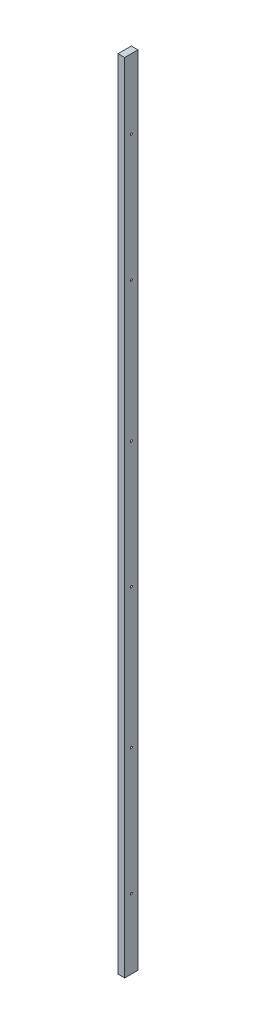
ISO-10303-21;
HEADER;
FILE_DESCRIPTION(('STEP AP214'),'2;1');
FILE_NAME('part.step','',(''),(''),'','','');
FILE_SCHEMA(('AUTOMOTIVE_DESIGN { 1 0 10303 214 1 1 1 1 }'));
ENDSEC;
DATA;
#1=APPLICATION_CONTEXT('core data for automotive mechanical design processes');
#2=APPLICATION_PROTOCOL_DEFINITION('international standard','automotive_design',2000,#1);
#3=PRODUCT_CONTEXT('',#1,'mechanical');
#4=PRODUCT('Part','Part','',(#3));
#5=PRODUCT_RELATED_PRODUCT_CATEGORY('part','',(#4));
#6=PRODUCT_DEFINITION_FORMATION('','',#4);
#7=PRODUCT_DEFINITION_CONTEXT('part definition',#1,'design');
#8=PRODUCT_DEFINITION('design','',#6,#7);
#9=PRODUCT_DEFINITION_SHAPE('','',#8);
#10=(LENGTH_UNIT() NAMED_UNIT(*) SI_UNIT(.MILLI.,.METRE.));
#11=(NAMED_UNIT(*) PLANE_ANGLE_UNIT() SI_UNIT($,.RADIAN.));
#12=(NAMED_UNIT(*) SI_UNIT($,.STERADIAN.) SOLID_ANGLE_UNIT());
#13=UNCERTAINTY_MEASURE_WITH_UNIT(LENGTH_MEASURE(1.E-05),#10,'distance_accuracy_value','');
#14=(GEOMETRIC_REPRESENTATION_CONTEXT(3) GLOBAL_UNCERTAINTY_ASSIGNED_CONTEXT((#13)) GLOBAL_UNIT_ASSIGNED_CONTEXT((#10,
#11,#12)) REPRESENTATION_CONTEXT('',''));
#15=CARTESIAN_POINT('',(0.,0.,0.));
#16=DIRECTION('',(0.,0.,1.));
#17=DIRECTION('',(1.,0.,0.));
#18=AXIS2_PLACEMENT_3D('',#15,#16,#17);
#19=CARTESIAN_POINT('',(-12.5,3000.,-25.));
#20=DIRECTION('',(1.,0.,0.));
#21=DIRECTION('',(0.,0.,-1.));
#22=AXIS2_PLACEMENT_3D('',#19,#20,#21);
#23=PLANE('',#22);
#24=CARTESIAN_POINT('',(-12.5,1737.5,0.));
#25=DIRECTION('',(-1.,0.,0.));
#26=DIRECTION('',(0.,0.,1.));
#27=AXIS2_PLACEMENT_3D('',#24,#25,#26);
#28=CIRCLE('',#27,4.);
#29=CARTESIAN_POINT('',(-12.5,1737.5,4.00000000000007));
#30=VERTEX_POINT('',#29);
#31=EDGE_CURVE('E137',#30,#30,#28,.T.);
#32=ORIENTED_EDGE('',*,*,#31,.F.);
#33=EDGE_LOOP('',(#32));
#34=FACE_BOUND('',#33,.T.);
#35=CARTESIAN_POINT('',(-12.5,1262.5,0.));
#36=DIRECTION('',(-1.,0.,0.));
#37=DIRECTION('',(0.,0.,1.));
#38=AXIS2_PLACEMENT_3D('',#35,#36,#37);
#39=CIRCLE('',#38,4.);
#40=CARTESIAN_POINT('',(-12.5,1262.5,4.));
#41=VERTEX_POINT('',#40);
#42=EDGE_CURVE('E144',#41,#41,#39,.T.);
#43=ORIENTED_EDGE('',*,*,#42,.F.);
#44=EDGE_LOOP('',(#43));
#45=FACE_BOUND('',#44,.T.);
#46=CARTESIAN_POINT('',(-12.5,2262.5,0.));
#47=DIRECTION('',(-1.,0.,0.));
#48=DIRECTION('',(0.,0.,1.));
#49=AXIS2_PLACEMENT_3D('',#46,#47,#48);
#50=CIRCLE('',#49,4.);
#51=CARTESIAN_POINT('',(-12.5,2262.5,4.00000000000006));
#52=VERTEX_POINT('',#51);
#53=EDGE_CURVE('E133',#52,#52,#50,.T.);
#54=ORIENTED_EDGE('',*,*,#53,.F.);
#55=EDGE_LOOP('',(#54));
#56=FACE_BOUND('',#55,.T.);
#57=CARTESIAN_POINT('',(-12.5000000000002,2737.5,0.));
#58=DIRECTION('',(1.,0.,0.));
#59=DIRECTION('',(0.,0.,-1.));
#60=AXIS2_PLACEMENT_3D('',#57,#58,#59);
#61=CIRCLE('',#60,4.);
#62=CARTESIAN_POINT('',(-12.5000000000002,2737.5,-4.00000000000004));
#63=VERTEX_POINT('',#62);
#64=EDGE_CURVE('E118',#63,#63,#61,.T.);
#65=ORIENTED_EDGE('',*,*,#64,.T.);
#66=EDGE_LOOP('',(#65));
#67=FACE_BOUND('',#66,.T.);
#68=CARTESIAN_POINT('',(-12.5000000000002,262.5,0.));
#69=DIRECTION('',(1.,0.,0.));
#70=DIRECTION('',(0.,0.,-1.));
#71=AXIS2_PLACEMENT_3D('',#68,#69,#70);
#72=CIRCLE('',#71,4.);
#73=CARTESIAN_POINT('',(-12.5000000000002,262.5,-4.));
#74=VERTEX_POINT('',#73);
#75=EDGE_CURVE('E170',#74,#74,#72,.T.);
#76=ORIENTED_EDGE('',*,*,#75,.T.);
#77=EDGE_LOOP('',(#76));
#78=FACE_BOUND('',#77,.T.);
#79=CARTESIAN_POINT('',(-12.5000000000002,737.5,0.));
#80=DIRECTION('',(1.,0.,0.));
#81=DIRECTION('',(0.,0.,-1.));
#82=AXIS2_PLACEMENT_3D('',#79,#80,#81);
#83=CIRCLE('',#82,4.);
#84=CARTESIAN_POINT('',(-12.5000000000002,737.5,-4.));
#85=VERTEX_POINT('',#84);
#86=EDGE_CURVE('E159',#85,#85,#83,.T.);
#87=ORIENTED_EDGE('',*,*,#86,.T.);
#88=EDGE_LOOP('',(#87));
#89=FACE_BOUND('',#88,.T.);
#90=DIRECTION('',(0.,0.,1.));
#91=VECTOR('',#90,1.);
#92=CARTESIAN_POINT('',(-12.5,0.,-25.));
#93=LINE('',#92,#91);
#94=CARTESIAN_POINT('',(-12.5,0.,-25.));
#95=VERTEX_POINT('',#94);
#96=CARTESIAN_POINT('',(-12.5,0.,25.));
#97=VERTEX_POINT('',#96);
#98=EDGE_CURVE('E114',#95,#97,#93,.T.);
#99=ORIENTED_EDGE('',*,*,#98,.T.);
#100=DIRECTION('',(0.,-1.,0.));
#101=VECTOR('',#100,1.);
#102=CARTESIAN_POINT('',(-12.5,3000.,25.));
#103=LINE('',#102,#101);
#104=CARTESIAN_POINT('',(-12.5,3000.,25.));
#105=VERTEX_POINT('',#104);
#106=EDGE_CURVE('E11',#105,#97,#103,.T.);
#107=ORIENTED_EDGE('',*,*,#106,.F.);
#108=DIRECTION('',(0.,0.,1.));
#109=VECTOR('',#108,1.);
#110=CARTESIAN_POINT('',(-12.5,3000.,-25.));
#111=LINE('',#110,#109);
#112=CARTESIAN_POINT('',(-12.5,3000.,-25.));
#113=VERTEX_POINT('',#112);
#114=EDGE_CURVE('E97',#113,#105,#111,.T.);
#115=ORIENTED_EDGE('',*,*,#114,.F.);
#116=DIRECTION('',(0.,-1.,0.));
#117=VECTOR('',#116,1.);
#118=CARTESIAN_POINT('',(-12.5,3000.,-25.));
#119=LINE('',#118,#117);
#120=EDGE_CURVE('E110',#113,#95,#119,.T.);
#121=ORIENTED_EDGE('',*,*,#120,.T.);
#122=EDGE_LOOP('',(#99,#107,#115,#121));
#123=FACE_BOUND('',#122,.T.);
#124=ADVANCED_FACE('F43',(#34,#45,#56,#67,#78,#89,#123),#23,.F.);
#125=CARTESIAN_POINT('',(12.5,3000.,25.));
#126=DIRECTION('',(0.,0.,-1.));
#127=DIRECTION('',(-1.,0.,0.));
#128=AXIS2_PLACEMENT_3D('',#125,#126,#127);
#129=PLANE('',#128);
#130=DIRECTION('',(1.,0.,0.));
#131=VECTOR('',#130,1.);
#132=CARTESIAN_POINT('',(12.5,0.,25.));
#133=LINE('',#132,#131);
#134=CARTESIAN_POINT('',(12.5,0.,25.));
#135=VERTEX_POINT('',#134);
#136=EDGE_CURVE('E102',#97,#135,#133,.T.);
#137=ORIENTED_EDGE('',*,*,#136,.T.);
#138=DIRECTION('',(0.,-1.,0.));
#139=VECTOR('',#138,1.);
#140=CARTESIAN_POINT('',(12.5,3000.,25.));
#141=LINE('',#140,#139);
#142=CARTESIAN_POINT('',(12.5,3000.,25.));
#143=VERTEX_POINT('',#142);
#144=EDGE_CURVE('E53',#143,#135,#141,.T.);
#145=ORIENTED_EDGE('',*,*,#144,.F.);
#146=DIRECTION('',(1.,0.,0.));
#147=VECTOR('',#146,1.);
#148=CARTESIAN_POINT('',(12.5,3000.,25.));
#149=LINE('',#148,#147);
#150=EDGE_CURVE('E92',#105,#143,#149,.T.);
#151=ORIENTED_EDGE('',*,*,#150,.F.);
#152=ORIENTED_EDGE('',*,*,#106,.T.);
#153=EDGE_LOOP('',(#137,#145,#151,#152));
#154=FACE_BOUND('',#153,.T.);
#155=ADVANCED_FACE('F101',(#154),#129,.F.);
#156=CARTESIAN_POINT('',(12.5,3000.,-25.));
#157=DIRECTION('',(-1.,0.,0.));
#158=DIRECTION('',(0.,0.,1.));
#159=AXIS2_PLACEMENT_3D('',#156,#157,#158);
#160=PLANE('',#159);
#161=CARTESIAN_POINT('',(12.5000000000002,1737.5,0.));
#162=DIRECTION('',(-1.,0.,0.));
#163=DIRECTION('',(0.,0.,1.));
#164=AXIS2_PLACEMENT_3D('',#161,#162,#163);
#165=CIRCLE('',#164,4.);
#166=CARTESIAN_POINT('',(12.5000000000002,1737.5,4.00000000000007));
#167=VERTEX_POINT('',#166);
#168=EDGE_CURVE('E46',#167,#167,#165,.T.);
#169=ORIENTED_EDGE('',*,*,#168,.T.);
#170=EDGE_LOOP('',(#169));
#171=FACE_BOUND('',#170,.T.);
#172=CARTESIAN_POINT('',(12.5000000000002,1262.5,0.));
#173=DIRECTION('',(-1.,0.,0.));
#174=DIRECTION('',(0.,0.,1.));
#175=AXIS2_PLACEMENT_3D('',#172,#173,#174);
#176=CIRCLE('',#175,4.);
#177=CARTESIAN_POINT('',(12.5000000000002,1262.5,4.));
#178=VERTEX_POINT('',#177);
#179=EDGE_CURVE('E134',#178,#178,#176,.T.);
#180=ORIENTED_EDGE('',*,*,#179,.T.);
#181=EDGE_LOOP('',(#180));
#182=FACE_BOUND('',#181,.T.);
#183=CARTESIAN_POINT('',(12.5000000000002,2262.5,0.));
#184=DIRECTION('',(-1.,0.,0.));
#185=DIRECTION('',(0.,0.,1.));
#186=AXIS2_PLACEMENT_3D('',#183,#184,#185);
#187=CIRCLE('',#186,4.);
#188=CARTESIAN_POINT('',(12.5000000000002,2262.5,4.00000000000006));
#189=VERTEX_POINT('',#188);
#190=EDGE_CURVE('E129',#189,#189,#187,.T.);
#191=ORIENTED_EDGE('',*,*,#190,.T.);
#192=EDGE_LOOP('',(#191));
#193=FACE_BOUND('',#192,.T.);
#194=CARTESIAN_POINT('',(12.5,2737.5,0.));
#195=DIRECTION('',(1.,0.,0.));
#196=DIRECTION('',(0.,0.,-1.));
#197=AXIS2_PLACEMENT_3D('',#194,#195,#196);
#198=CIRCLE('',#197,4.);
#199=CARTESIAN_POINT('',(12.5,2737.5,-4.00000000000004));
#200=VERTEX_POINT('',#199);
#201=EDGE_CURVE('E155',#200,#200,#198,.T.);
#202=ORIENTED_EDGE('',*,*,#201,.F.);
#203=EDGE_LOOP('',(#202));
#204=FACE_BOUND('',#203,.T.);
#205=CARTESIAN_POINT('',(12.5,262.5,0.));
#206=DIRECTION('',(1.,0.,0.));
#207=DIRECTION('',(0.,0.,-1.));
#208=AXIS2_PLACEMENT_3D('',#205,#206,#207);
#209=CIRCLE('',#208,4.);
#210=CARTESIAN_POINT('',(12.5,262.5,-4.));
#211=VERTEX_POINT('',#210);
#212=EDGE_CURVE('E160',#211,#211,#209,.T.);
#213=ORIENTED_EDGE('',*,*,#212,.F.);
#214=EDGE_LOOP('',(#213));
#215=FACE_BOUND('',#214,.T.);
#216=CARTESIAN_POINT('',(12.5,737.5,0.));
#217=DIRECTION('',(1.,0.,0.));
#218=DIRECTION('',(0.,0.,-1.));
#219=AXIS2_PLACEMENT_3D('',#216,#217,#218);
#220=CIRCLE('',#219,4.);
#221=CARTESIAN_POINT('',(12.5,737.5,-4.));
#222=VERTEX_POINT('',#221);
#223=EDGE_CURVE('E132',#222,#222,#220,.T.);
#224=ORIENTED_EDGE('',*,*,#223,.F.);
#225=EDGE_LOOP('',(#224));
#226=FACE_BOUND('',#225,.T.);
#227=DIRECTION('',(0.,0.,-1.));
#228=VECTOR('',#227,1.);
#229=CARTESIAN_POINT('',(12.5,0.,-25.));
#230=LINE('',#229,#228);
#231=CARTESIAN_POINT('',(12.5,0.,-25.));
#232=VERTEX_POINT('',#231);
#233=EDGE_CURVE('E79',#135,#232,#230,.T.);
#234=ORIENTED_EDGE('',*,*,#233,.T.);
#235=DIRECTION('',(0.,-1.,0.));
#236=VECTOR('',#235,1.);
#237=CARTESIAN_POINT('',(12.5,3000.,-25.));
#238=LINE('',#237,#236);
#239=CARTESIAN_POINT('',(12.5,3000.,-25.));
#240=VERTEX_POINT('',#239);
#241=EDGE_CURVE('E104',#240,#232,#238,.T.);
#242=ORIENTED_EDGE('',*,*,#241,.F.);
#243=DIRECTION('',(0.,0.,-1.));
#244=VECTOR('',#243,1.);
#245=CARTESIAN_POINT('',(12.5,3000.,-25.));
#246=LINE('',#245,#244);
#247=EDGE_CURVE('E95',#143,#240,#246,.T.);
#248=ORIENTED_EDGE('',*,*,#247,.F.);
#249=ORIENTED_EDGE('',*,*,#144,.T.);
#250=EDGE_LOOP('',(#234,#242,#248,#249));
#251=FACE_BOUND('',#250,.T.);
#252=ADVANCED_FACE('F106',(#171,#182,#193,#204,#215,#226,#251),#160,.F.);
#253=CARTESIAN_POINT('',(12.5,3000.,-25.));
#254=DIRECTION('',(0.,0.,1.));
#255=DIRECTION('',(1.,0.,0.));
#256=AXIS2_PLACEMENT_3D('',#253,#254,#255);
#257=PLANE('',#256);
#258=DIRECTION('',(-1.,0.,0.));
#259=VECTOR('',#258,1.);
#260=CARTESIAN_POINT('',(12.5,0.,-25.));
#261=LINE('',#260,#259);
#262=EDGE_CURVE('E85',#232,#95,#261,.T.);
#263=ORIENTED_EDGE('',*,*,#262,.T.);
#264=ORIENTED_EDGE('',*,*,#120,.F.);
#265=DIRECTION('',(-1.,0.,0.));
#266=VECTOR('',#265,1.);
#267=CARTESIAN_POINT('',(12.5,3000.,-25.));
#268=LINE('',#267,#266);
#269=EDGE_CURVE('E62',#240,#113,#268,.T.);
#270=ORIENTED_EDGE('',*,*,#269,.F.);
#271=ORIENTED_EDGE('',*,*,#241,.T.);
#272=EDGE_LOOP('',(#263,#264,#270,#271));
#273=FACE_BOUND('',#272,.T.);
#274=ADVANCED_FACE('F211',(#273),#257,.F.);
#275=CARTESIAN_POINT('',(0.,3000.,0.));
#276=DIRECTION('',(0.,-1.,0.));
#277=DIRECTION('',(0.,0.,-1.));
#278=AXIS2_PLACEMENT_3D('',#275,#276,#277);
#279=PLANE('',#278);
#280=ORIENTED_EDGE('',*,*,#114,.T.);
#281=ORIENTED_EDGE('',*,*,#150,.T.);
#282=ORIENTED_EDGE('',*,*,#247,.T.);
#283=ORIENTED_EDGE('',*,*,#269,.T.);
#284=EDGE_LOOP('',(#280,#281,#282,#283));
#285=FACE_BOUND('',#284,.T.);
#286=ADVANCED_FACE('F93',(#285),#279,.F.);
#287=CARTESIAN_POINT('',(0.,0.,0.));
#288=DIRECTION('',(0.,-1.,0.));
#289=DIRECTION('',(0.,0.,-1.));
#290=AXIS2_PLACEMENT_3D('',#287,#288,#289);
#291=PLANE('',#290);
#292=ORIENTED_EDGE('',*,*,#98,.F.);
#293=ORIENTED_EDGE('',*,*,#262,.F.);
#294=ORIENTED_EDGE('',*,*,#233,.F.);
#295=ORIENTED_EDGE('',*,*,#136,.F.);
#296=EDGE_LOOP('',(#292,#293,#294,#295));
#297=FACE_BOUND('',#296,.T.);
#298=ADVANCED_FACE('F222',(#297),#291,.T.);
#299=CARTESIAN_POINT('',(-2987.5,737.5,0.));
#300=DIRECTION('',(1.,0.,0.));
#301=DIRECTION('',(0.,0.,-1.));
#302=AXIS2_PLACEMENT_3D('',#299,#300,#301);
#303=CYLINDRICAL_SURFACE('',#302,4.);
#304=ORIENTED_EDGE('',*,*,#223,.T.);
#305=EDGE_LOOP('',(#304));
#306=FACE_BOUND('',#305,.T.);
#307=ORIENTED_EDGE('',*,*,#86,.F.);
#308=EDGE_LOOP('',(#307));
#309=FACE_BOUND('',#308,.T.);
#310=ADVANCED_FACE('F194',(#306,#309),#303,.F.);
#311=CARTESIAN_POINT('',(-2987.5,262.5,0.));
#312=DIRECTION('',(1.,0.,0.));
#313=DIRECTION('',(0.,0.,-1.));
#314=AXIS2_PLACEMENT_3D('',#311,#312,#313);
#315=CYLINDRICAL_SURFACE('',#314,4.);
#316=ORIENTED_EDGE('',*,*,#212,.T.);
#317=EDGE_LOOP('',(#316));
#318=FACE_BOUND('',#317,.T.);
#319=ORIENTED_EDGE('',*,*,#75,.F.);
#320=EDGE_LOOP('',(#319));
#321=FACE_BOUND('',#320,.T.);
#322=ADVANCED_FACE('F184',(#318,#321),#315,.F.);
#323=CARTESIAN_POINT('',(-2987.5,2737.5,0.));
#324=DIRECTION('',(1.,0.,0.));
#325=DIRECTION('',(0.,0.,-1.));
#326=AXIS2_PLACEMENT_3D('',#323,#324,#325);
#327=CYLINDRICAL_SURFACE('',#326,4.);
#328=ORIENTED_EDGE('',*,*,#201,.T.);
#329=EDGE_LOOP('',(#328));
#330=FACE_BOUND('',#329,.T.);
#331=ORIENTED_EDGE('',*,*,#64,.F.);
#332=EDGE_LOOP('',(#331));
#333=FACE_BOUND('',#332,.T.);
#334=ADVANCED_FACE('F181',(#330,#333),#327,.F.);
#335=CARTESIAN_POINT('',(2987.5,2262.5,0.));
#336=DIRECTION('',(-1.,0.,0.));
#337=DIRECTION('',(0.,0.,1.));
#338=AXIS2_PLACEMENT_3D('',#335,#336,#337);
#339=CYLINDRICAL_SURFACE('',#338,4.);
#340=ORIENTED_EDGE('',*,*,#53,.T.);
#341=EDGE_LOOP('',(#340));
#342=FACE_BOUND('',#341,.T.);
#343=ORIENTED_EDGE('',*,*,#190,.F.);
#344=EDGE_LOOP('',(#343));
#345=FACE_BOUND('',#344,.T.);
#346=ADVANCED_FACE('F183',(#342,#345),#339,.F.);
#347=CARTESIAN_POINT('',(2987.5,1262.5,0.));
#348=DIRECTION('',(-1.,0.,0.));
#349=DIRECTION('',(0.,0.,1.));
#350=AXIS2_PLACEMENT_3D('',#347,#348,#349);
#351=CYLINDRICAL_SURFACE('',#350,4.);
#352=ORIENTED_EDGE('',*,*,#42,.T.);
#353=EDGE_LOOP('',(#352));
#354=FACE_BOUND('',#353,.T.);
#355=ORIENTED_EDGE('',*,*,#179,.F.);
#356=EDGE_LOOP('',(#355));
#357=FACE_BOUND('',#356,.T.);
#358=ADVANCED_FACE('F191',(#354,#357),#351,.F.);
#359=CARTESIAN_POINT('',(2987.5,1737.5,0.));
#360=DIRECTION('',(-1.,0.,0.));
#361=DIRECTION('',(0.,0.,1.));
#362=AXIS2_PLACEMENT_3D('',#359,#360,#361);
#363=CYLINDRICAL_SURFACE('',#362,4.);
#364=ORIENTED_EDGE('',*,*,#31,.T.);
#365=EDGE_LOOP('',(#364));
#366=FACE_BOUND('',#365,.T.);
#367=ORIENTED_EDGE('',*,*,#168,.F.);
#368=EDGE_LOOP('',(#367));
#369=FACE_BOUND('',#368,.T.);
#370=ADVANCED_FACE('F298',(#366,#369),#363,.F.);
#371=CLOSED_SHELL('',(#124,#155,#252,#274,#286,#298,#310,#322,#334,#346,#358,#370));
#372=MANIFOLD_SOLID_BREP('B2',#371);
#373=ADVANCED_BREP_SHAPE_REPRESENTATION('',(#18,#372),#14);
#374=SHAPE_DEFINITION_REPRESENTATION(#9,#373);
ENDSEC;
END-ISO-10303-21;
